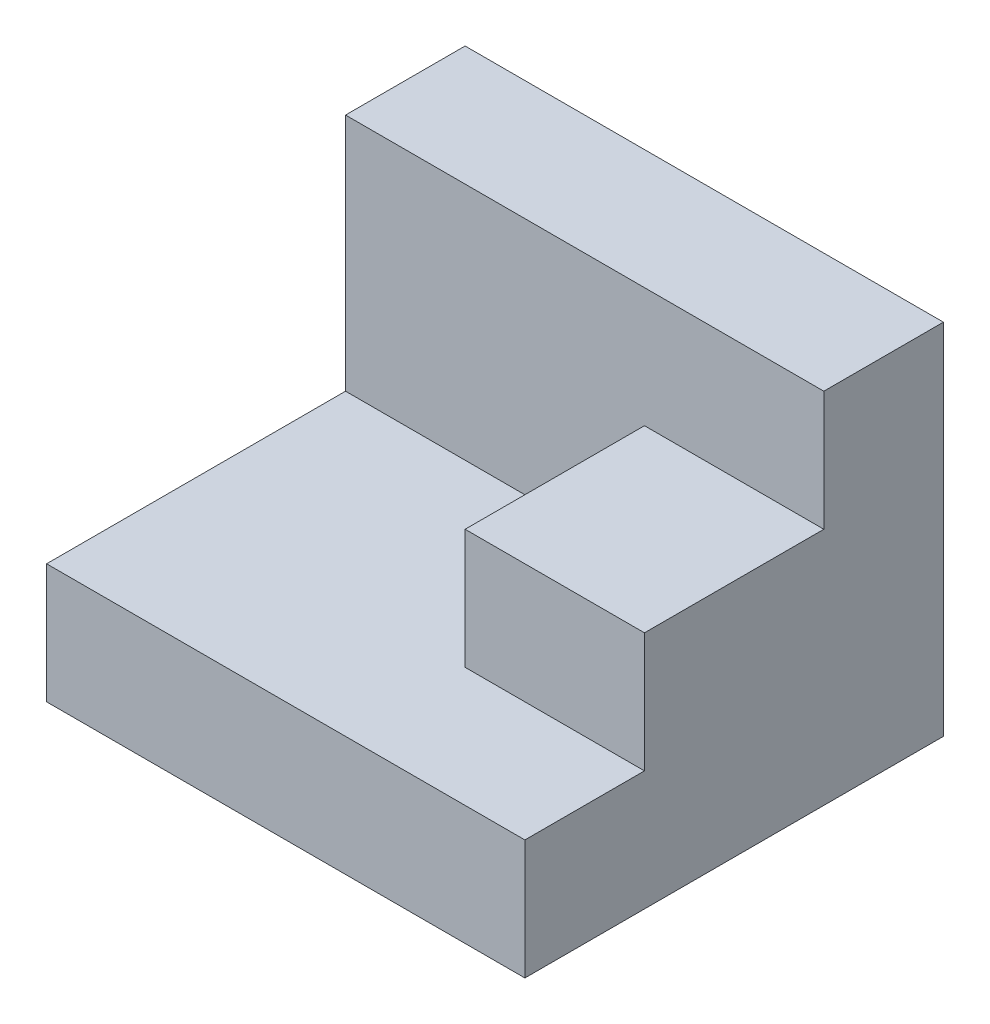
ISO-10303-21;
HEADER;
FILE_DESCRIPTION(('STEP AP214'),'2;1');
FILE_NAME('part.step','',(''),(''),'','','');
FILE_SCHEMA(('AUTOMOTIVE_DESIGN { 1 0 10303 214 1 1 1 1 }'));
ENDSEC;
DATA;
#1=APPLICATION_CONTEXT('core data for automotive mechanical design processes');
#2=APPLICATION_PROTOCOL_DEFINITION('international standard','automotive_design',2000,#1);
#3=PRODUCT_CONTEXT('',#1,'mechanical');
#4=PRODUCT('Part','Part','',(#3));
#5=PRODUCT_RELATED_PRODUCT_CATEGORY('part','',(#4));
#6=PRODUCT_DEFINITION_FORMATION('','',#4);
#7=PRODUCT_DEFINITION_CONTEXT('part definition',#1,'design');
#8=PRODUCT_DEFINITION('design','',#6,#7);
#9=PRODUCT_DEFINITION_SHAPE('','',#8);
#10=(LENGTH_UNIT() NAMED_UNIT(*) SI_UNIT(.MILLI.,.METRE.));
#11=(NAMED_UNIT(*) PLANE_ANGLE_UNIT() SI_UNIT($,.RADIAN.));
#12=(NAMED_UNIT(*) SI_UNIT($,.STERADIAN.) SOLID_ANGLE_UNIT());
#13=UNCERTAINTY_MEASURE_WITH_UNIT(LENGTH_MEASURE(1.E-05),#10,'distance_accuracy_value','');
#14=(GEOMETRIC_REPRESENTATION_CONTEXT(3) GLOBAL_UNCERTAINTY_ASSIGNED_CONTEXT((#13)) GLOBAL_UNIT_ASSIGNED_CONTEXT((#10,
#11,#12)) REPRESENTATION_CONTEXT('',''));
#15=CARTESIAN_POINT('',(0.,0.,0.));
#16=DIRECTION('',(0.,0.,1.));
#17=DIRECTION('',(1.,0.,0.));
#18=AXIS2_PLACEMENT_3D('',#15,#16,#17);
#19=CARTESIAN_POINT('',(0.,0.,10.));
#20=DIRECTION('',(0.,0.,1.));
#21=DIRECTION('',(1.,0.,0.));
#22=AXIS2_PLACEMENT_3D('',#19,#20,#21);
#23=PLANE('',#22);
#24=DIRECTION('',(-1.,0.,0.));
#25=VECTOR('',#24,1.);
#26=CARTESIAN_POINT('',(0.,10.,10.));
#27=LINE('',#26,#25);
#28=CARTESIAN_POINT('',(25.,10.,10.));
#29=VERTEX_POINT('',#28);
#30=CARTESIAN_POINT('',(0.,10.,10.));
#31=VERTEX_POINT('',#30);
#32=EDGE_CURVE('E146',#29,#31,#27,.T.);
#33=ORIENTED_EDGE('',*,*,#32,.F.);
#34=DIRECTION('',(0.,1.,0.));
#35=VECTOR('',#34,1.);
#36=CARTESIAN_POINT('',(25.,0.,10.));
#37=LINE('',#36,#35);
#38=CARTESIAN_POINT('',(25.,20.,10.));
#39=VERTEX_POINT('',#38);
#40=EDGE_CURVE('E105',#29,#39,#37,.T.);
#41=ORIENTED_EDGE('',*,*,#40,.T.);
#42=DIRECTION('',(1.,0.,0.));
#43=VECTOR('',#42,1.);
#44=CARTESIAN_POINT('',(0.,20.,10.));
#45=LINE('',#44,#43);
#46=CARTESIAN_POINT('',(40.,20.,10.));
#47=VERTEX_POINT('',#46);
#48=EDGE_CURVE('E109',#39,#47,#45,.T.);
#49=ORIENTED_EDGE('',*,*,#48,.T.);
#50=DIRECTION('',(0.,1.,0.));
#51=VECTOR('',#50,1.);
#52=CARTESIAN_POINT('',(40.,0.,10.));
#53=LINE('',#52,#51);
#54=CARTESIAN_POINT('',(40.,30.,10.));
#55=VERTEX_POINT('',#54);
#56=EDGE_CURVE('E89',#47,#55,#53,.T.);
#57=ORIENTED_EDGE('',*,*,#56,.T.);
#58=DIRECTION('',(-1.,0.,0.));
#59=VECTOR('',#58,1.);
#60=CARTESIAN_POINT('',(0.,30.,10.));
#61=LINE('',#60,#59);
#62=CARTESIAN_POINT('',(0.,30.,10.));
#63=VERTEX_POINT('',#62);
#64=EDGE_CURVE('E57',#55,#63,#61,.T.);
#65=ORIENTED_EDGE('',*,*,#64,.T.);
#66=DIRECTION('',(0.,-1.,0.));
#67=VECTOR('',#66,1.);
#68=CARTESIAN_POINT('',(0.,0.,10.));
#69=LINE('',#68,#67);
#70=EDGE_CURVE('E101',#63,#31,#69,.T.);
#71=ORIENTED_EDGE('',*,*,#70,.T.);
#72=EDGE_LOOP('',(#33,#41,#49,#57,#65,#71));
#73=FACE_BOUND('',#72,.T.);
#74=ADVANCED_FACE('F33',(#73),#23,.T.);
#75=CARTESIAN_POINT('',(40.,0.,10.));
#76=DIRECTION('',(-1.,0.,0.));
#77=DIRECTION('',(0.,0.,1.));
#78=AXIS2_PLACEMENT_3D('',#75,#76,#77);
#79=PLANE('',#78);
#80=DIRECTION('',(0.,1.,0.));
#81=VECTOR('',#80,1.);
#82=CARTESIAN_POINT('',(40.,0.,25.));
#83=LINE('',#82,#81);
#84=CARTESIAN_POINT('',(40.,10.,25.));
#85=VERTEX_POINT('',#84);
#86=CARTESIAN_POINT('',(40.,20.,25.));
#87=VERTEX_POINT('',#86);
#88=EDGE_CURVE('E137',#85,#87,#83,.T.);
#89=ORIENTED_EDGE('',*,*,#88,.F.);
#90=DIRECTION('',(0.,0.,-1.));
#91=VECTOR('',#90,1.);
#92=CARTESIAN_POINT('',(40.,10.,35.));
#93=LINE('',#92,#91);
#94=CARTESIAN_POINT('',(40.,10.,35.));
#95=VERTEX_POINT('',#94);
#96=EDGE_CURVE('E151',#95,#85,#93,.T.);
#97=ORIENTED_EDGE('',*,*,#96,.F.);
#98=DIRECTION('',(0.,1.,0.));
#99=VECTOR('',#98,1.);
#100=CARTESIAN_POINT('',(40.,0.,35.));
#101=LINE('',#100,#99);
#102=CARTESIAN_POINT('',(40.,0.,35.));
#103=VERTEX_POINT('',#102);
#104=EDGE_CURVE('E100',#103,#95,#101,.T.);
#105=ORIENTED_EDGE('',*,*,#104,.F.);
#106=DIRECTION('',(0.,0.,-1.));
#107=VECTOR('',#106,1.);
#108=CARTESIAN_POINT('',(40.,0.,10.));
#109=LINE('',#108,#107);
#110=CARTESIAN_POINT('',(40.,0.,0.));
#111=VERTEX_POINT('',#110);
#112=EDGE_CURVE('E82',#103,#111,#109,.T.);
#113=ORIENTED_EDGE('',*,*,#112,.T.);
#114=DIRECTION('',(0.,1.,0.));
#115=VECTOR('',#114,1.);
#116=CARTESIAN_POINT('',(40.,0.,0.));
#117=LINE('',#116,#115);
#118=CARTESIAN_POINT('',(40.,30.,0.));
#119=VERTEX_POINT('',#118);
#120=EDGE_CURVE('E96',#111,#119,#117,.T.);
#121=ORIENTED_EDGE('',*,*,#120,.T.);
#122=DIRECTION('',(0.,0.,-1.));
#123=VECTOR('',#122,1.);
#124=CARTESIAN_POINT('',(40.,30.,10.));
#125=LINE('',#124,#123);
#126=EDGE_CURVE('E11',#55,#119,#125,.T.);
#127=ORIENTED_EDGE('',*,*,#126,.F.);
#128=ORIENTED_EDGE('',*,*,#56,.F.);
#129=DIRECTION('',(0.,0.,-1.));
#130=VECTOR('',#129,1.);
#131=CARTESIAN_POINT('',(40.,20.,25.));
#132=LINE('',#131,#130);
#133=EDGE_CURVE('E48',#87,#47,#132,.T.);
#134=ORIENTED_EDGE('',*,*,#133,.F.);
#135=EDGE_LOOP('',(#89,#97,#105,#113,#121,#127,#128,#134));
#136=FACE_BOUND('',#135,.T.);
#137=ADVANCED_FACE('F35',(#136),#79,.F.);
#138=CARTESIAN_POINT('',(0.,30.,10.));
#139=DIRECTION('',(0.,-1.,0.));
#140=DIRECTION('',(1.,0.,0.));
#141=AXIS2_PLACEMENT_3D('',#138,#139,#140);
#142=PLANE('',#141);
#143=DIRECTION('',(-1.,0.,0.));
#144=VECTOR('',#143,1.);
#145=CARTESIAN_POINT('',(0.,30.,0.));
#146=LINE('',#145,#144);
#147=CARTESIAN_POINT('',(0.,30.,0.));
#148=VERTEX_POINT('',#147);
#149=EDGE_CURVE('E104',#119,#148,#146,.T.);
#150=ORIENTED_EDGE('',*,*,#149,.T.);
#151=DIRECTION('',(0.,0.,-1.));
#152=VECTOR('',#151,1.);
#153=CARTESIAN_POINT('',(0.,30.,10.));
#154=LINE('',#153,#152);
#155=EDGE_CURVE('E41',#63,#148,#154,.T.);
#156=ORIENTED_EDGE('',*,*,#155,.F.);
#157=ORIENTED_EDGE('',*,*,#64,.F.);
#158=ORIENTED_EDGE('',*,*,#126,.T.);
#159=EDGE_LOOP('',(#150,#156,#157,#158));
#160=FACE_BOUND('',#159,.T.);
#161=ADVANCED_FACE('F121',(#160),#142,.F.);
#162=CARTESIAN_POINT('',(0.,0.,10.));
#163=DIRECTION('',(1.,0.,0.));
#164=DIRECTION('',(0.,1.,0.));
#165=AXIS2_PLACEMENT_3D('',#162,#163,#164);
#166=PLANE('',#165);
#167=DIRECTION('',(0.,-1.,0.));
#168=VECTOR('',#167,1.);
#169=CARTESIAN_POINT('',(0.,0.,0.));
#170=LINE('',#169,#168);
#171=CARTESIAN_POINT('',(0.,0.,0.));
#172=VERTEX_POINT('',#171);
#173=EDGE_CURVE('E90',#148,#172,#170,.T.);
#174=ORIENTED_EDGE('',*,*,#173,.T.);
#175=DIRECTION('',(0.,0.,-1.));
#176=VECTOR('',#175,1.);
#177=CARTESIAN_POINT('',(0.,0.,10.));
#178=LINE('',#177,#176);
#179=CARTESIAN_POINT('',(0.,0.,35.));
#180=VERTEX_POINT('',#179);
#181=EDGE_CURVE('E85',#180,#172,#178,.T.);
#182=ORIENTED_EDGE('',*,*,#181,.F.);
#183=DIRECTION('',(0.,-1.,0.));
#184=VECTOR('',#183,1.);
#185=CARTESIAN_POINT('',(0.,0.,35.));
#186=LINE('',#185,#184);
#187=CARTESIAN_POINT('',(0.,10.,35.));
#188=VERTEX_POINT('',#187);
#189=EDGE_CURVE('E157',#188,#180,#186,.T.);
#190=ORIENTED_EDGE('',*,*,#189,.F.);
#191=DIRECTION('',(0.,0.,-1.));
#192=VECTOR('',#191,1.);
#193=CARTESIAN_POINT('',(0.,10.,35.));
#194=LINE('',#193,#192);
#195=EDGE_CURVE('E149',#188,#31,#194,.T.);
#196=ORIENTED_EDGE('',*,*,#195,.T.);
#197=ORIENTED_EDGE('',*,*,#70,.F.);
#198=ORIENTED_EDGE('',*,*,#155,.T.);
#199=EDGE_LOOP('',(#174,#182,#190,#196,#197,#198));
#200=FACE_BOUND('',#199,.T.);
#201=ADVANCED_FACE('F118',(#200),#166,.F.);
#202=CARTESIAN_POINT('',(0.,0.,10.));
#203=DIRECTION('',(0.,1.,0.));
#204=DIRECTION('',(0.,0.,1.));
#205=AXIS2_PLACEMENT_3D('',#202,#203,#204);
#206=PLANE('',#205);
#207=DIRECTION('',(1.,0.,0.));
#208=VECTOR('',#207,1.);
#209=CARTESIAN_POINT('',(0.,0.,0.));
#210=LINE('',#209,#208);
#211=EDGE_CURVE('E77',#172,#111,#210,.T.);
#212=ORIENTED_EDGE('',*,*,#211,.T.);
#213=ORIENTED_EDGE('',*,*,#112,.F.);
#214=DIRECTION('',(1.,0.,0.));
#215=VECTOR('',#214,1.);
#216=CARTESIAN_POINT('',(0.,0.,35.));
#217=LINE('',#216,#215);
#218=EDGE_CURVE('E155',#180,#103,#217,.T.);
#219=ORIENTED_EDGE('',*,*,#218,.F.);
#220=ORIENTED_EDGE('',*,*,#181,.T.);
#221=EDGE_LOOP('',(#212,#213,#219,#220));
#222=FACE_BOUND('',#221,.T.);
#223=ADVANCED_FACE('F79',(#222),#206,.F.);
#224=CARTESIAN_POINT('',(0.,0.,0.));
#225=DIRECTION('',(0.,0.,1.));
#226=DIRECTION('',(1.,0.,0.));
#227=AXIS2_PLACEMENT_3D('',#224,#225,#226);
#228=PLANE('',#227);
#229=ORIENTED_EDGE('',*,*,#149,.F.);
#230=ORIENTED_EDGE('',*,*,#120,.F.);
#231=ORIENTED_EDGE('',*,*,#211,.F.);
#232=ORIENTED_EDGE('',*,*,#173,.F.);
#233=EDGE_LOOP('',(#229,#230,#231,#232));
#234=FACE_BOUND('',#233,.T.);
#235=ADVANCED_FACE('F103',(#234),#228,.F.);
#236=CARTESIAN_POINT('',(25.,0.,25.));
#237=DIRECTION('',(1.,0.,0.));
#238=DIRECTION('',(0.,1.,0.));
#239=AXIS2_PLACEMENT_3D('',#236,#237,#238);
#240=PLANE('',#239);
#241=ORIENTED_EDGE('',*,*,#40,.F.);
#242=DIRECTION('',(0.,0.,-1.));
#243=VECTOR('',#242,1.);
#244=CARTESIAN_POINT('',(25.,10.,25.));
#245=LINE('',#244,#243);
#246=CARTESIAN_POINT('',(25.,10.,25.));
#247=VERTEX_POINT('',#246);
#248=EDGE_CURVE('E127',#247,#29,#245,.T.);
#249=ORIENTED_EDGE('',*,*,#248,.F.);
#250=DIRECTION('',(0.,-1.,0.));
#251=VECTOR('',#250,1.);
#252=CARTESIAN_POINT('',(25.,0.,25.));
#253=LINE('',#252,#251);
#254=CARTESIAN_POINT('',(25.,20.,25.));
#255=VERTEX_POINT('',#254);
#256=EDGE_CURVE('E143',#255,#247,#253,.T.);
#257=ORIENTED_EDGE('',*,*,#256,.F.);
#258=DIRECTION('',(0.,0.,-1.));
#259=VECTOR('',#258,1.);
#260=CARTESIAN_POINT('',(25.,20.,25.));
#261=LINE('',#260,#259);
#262=EDGE_CURVE('E131',#255,#39,#261,.T.);
#263=ORIENTED_EDGE('',*,*,#262,.T.);
#264=EDGE_LOOP('',(#241,#249,#257,#263));
#265=FACE_BOUND('',#264,.T.);
#266=ADVANCED_FACE('F193',(#265),#240,.F.);
#267=CARTESIAN_POINT('',(0.,20.,25.));
#268=DIRECTION('',(0.,-1.,0.));
#269=DIRECTION('',(1.,0.,0.));
#270=AXIS2_PLACEMENT_3D('',#267,#268,#269);
#271=PLANE('',#270);
#272=ORIENTED_EDGE('',*,*,#48,.F.);
#273=ORIENTED_EDGE('',*,*,#262,.F.);
#274=DIRECTION('',(-1.,0.,0.));
#275=VECTOR('',#274,1.);
#276=CARTESIAN_POINT('',(0.,20.,25.));
#277=LINE('',#276,#275);
#278=EDGE_CURVE('E134',#87,#255,#277,.T.);
#279=ORIENTED_EDGE('',*,*,#278,.F.);
#280=ORIENTED_EDGE('',*,*,#133,.T.);
#281=EDGE_LOOP('',(#272,#273,#279,#280));
#282=FACE_BOUND('',#281,.T.);
#283=ADVANCED_FACE('F189',(#282),#271,.F.);
#284=CARTESIAN_POINT('',(0.,0.,25.));
#285=DIRECTION('',(0.,0.,1.));
#286=DIRECTION('',(1.,0.,0.));
#287=AXIS2_PLACEMENT_3D('',#284,#285,#286);
#288=PLANE('',#287);
#289=ORIENTED_EDGE('',*,*,#256,.T.);
#290=DIRECTION('',(1.,0.,0.));
#291=VECTOR('',#290,1.);
#292=CARTESIAN_POINT('',(0.,10.,25.));
#293=LINE('',#292,#291);
#294=EDGE_CURVE('E140',#247,#85,#293,.T.);
#295=ORIENTED_EDGE('',*,*,#294,.T.);
#296=ORIENTED_EDGE('',*,*,#88,.T.);
#297=ORIENTED_EDGE('',*,*,#278,.T.);
#298=EDGE_LOOP('',(#289,#295,#296,#297));
#299=FACE_BOUND('',#298,.T.);
#300=ADVANCED_FACE('F197',(#299),#288,.T.);
#301=CARTESIAN_POINT('',(0.,10.,35.));
#302=DIRECTION('',(0.,1.,0.));
#303=DIRECTION('',(0.,0.,1.));
#304=AXIS2_PLACEMENT_3D('',#301,#302,#303);
#305=PLANE('',#304);
#306=ORIENTED_EDGE('',*,*,#248,.T.);
#307=ORIENTED_EDGE('',*,*,#32,.T.);
#308=ORIENTED_EDGE('',*,*,#195,.F.);
#309=DIRECTION('',(1.,0.,0.));
#310=VECTOR('',#309,1.);
#311=CARTESIAN_POINT('',(0.,10.,35.));
#312=LINE('',#311,#310);
#313=EDGE_CURVE('E160',#188,#95,#312,.T.);
#314=ORIENTED_EDGE('',*,*,#313,.T.);
#315=ORIENTED_EDGE('',*,*,#96,.T.);
#316=ORIENTED_EDGE('',*,*,#294,.F.);
#317=EDGE_LOOP('',(#306,#307,#308,#314,#315,#316));
#318=FACE_BOUND('',#317,.T.);
#319=ADVANCED_FACE('F166',(#318),#305,.T.);
#320=CARTESIAN_POINT('',(0.,0.,35.));
#321=DIRECTION('',(0.,0.,1.));
#322=DIRECTION('',(1.,0.,0.));
#323=AXIS2_PLACEMENT_3D('',#320,#321,#322);
#324=PLANE('',#323);
#325=ORIENTED_EDGE('',*,*,#313,.F.);
#326=ORIENTED_EDGE('',*,*,#189,.T.);
#327=ORIENTED_EDGE('',*,*,#218,.T.);
#328=ORIENTED_EDGE('',*,*,#104,.T.);
#329=EDGE_LOOP('',(#325,#326,#327,#328));
#330=FACE_BOUND('',#329,.T.);
#331=ADVANCED_FACE('F174',(#330),#324,.T.);
#332=CLOSED_SHELL('',(#74,#137,#161,#201,#223,#235,#266,#283,#300,#319,#331));
#333=MANIFOLD_SOLID_BREP('B2',#332);
#334=ADVANCED_BREP_SHAPE_REPRESENTATION('',(#18,#333),#14);
#335=SHAPE_DEFINITION_REPRESENTATION(#9,#334);
ENDSEC;
END-ISO-10303-21;
